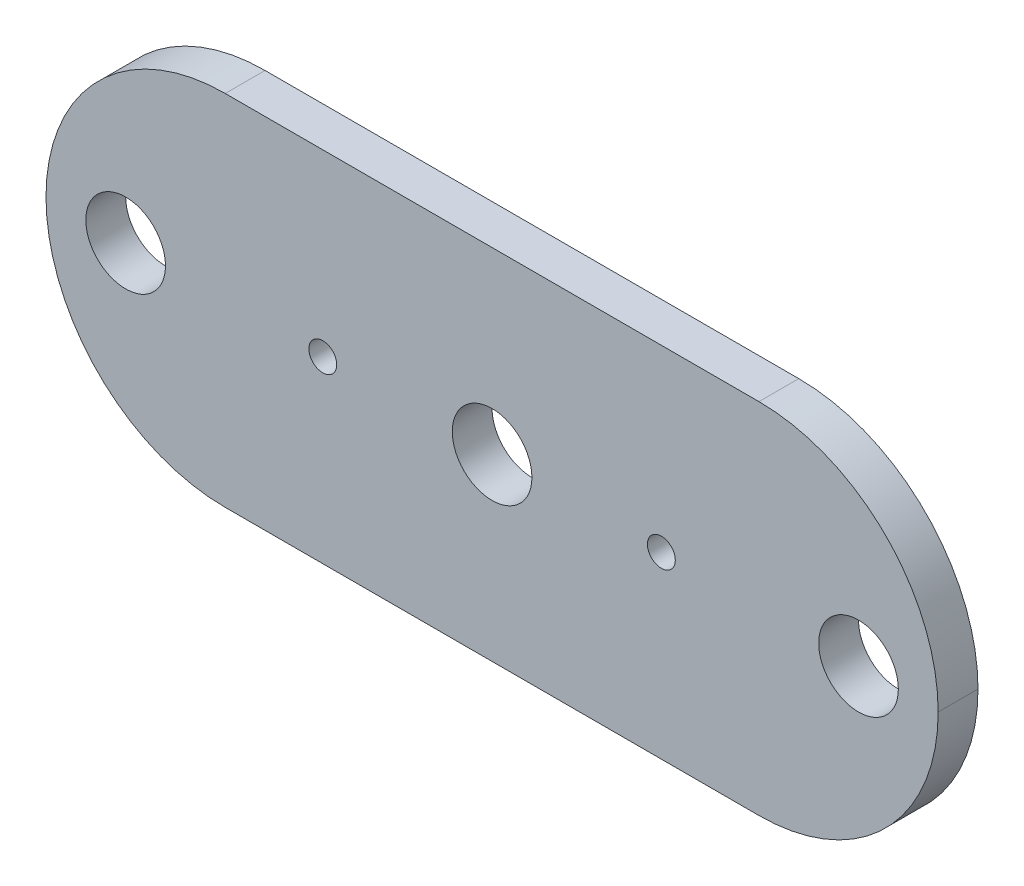
ISO-10303-21;
HEADER;
FILE_DESCRIPTION(('STEP AP214'),'2;1');
FILE_NAME('part.step','',(''),(''),'','','');
FILE_SCHEMA(('AUTOMOTIVE_DESIGN { 1 0 10303 214 1 1 1 1 }'));
ENDSEC;
DATA;
#1=APPLICATION_CONTEXT('core data for automotive mechanical design processes');
#2=APPLICATION_PROTOCOL_DEFINITION('international standard','automotive_design',2000,#1);
#3=PRODUCT_CONTEXT('',#1,'mechanical');
#4=PRODUCT('Part','Part','',(#3));
#5=PRODUCT_RELATED_PRODUCT_CATEGORY('part','',(#4));
#6=PRODUCT_DEFINITION_FORMATION('','',#4);
#7=PRODUCT_DEFINITION_CONTEXT('part definition',#1,'design');
#8=PRODUCT_DEFINITION('design','',#6,#7);
#9=PRODUCT_DEFINITION_SHAPE('','',#8);
#10=(LENGTH_UNIT() NAMED_UNIT(*) SI_UNIT(.MILLI.,.METRE.));
#11=(NAMED_UNIT(*) PLANE_ANGLE_UNIT() SI_UNIT($,.RADIAN.));
#12=(NAMED_UNIT(*) SI_UNIT($,.STERADIAN.) SOLID_ANGLE_UNIT());
#13=UNCERTAINTY_MEASURE_WITH_UNIT(LENGTH_MEASURE(1.E-05),#10,'distance_accuracy_value','');
#14=(GEOMETRIC_REPRESENTATION_CONTEXT(3) GLOBAL_UNCERTAINTY_ASSIGNED_CONTEXT((#13)) GLOBAL_UNIT_ASSIGNED_CONTEXT((#10,
#11,#12)) REPRESENTATION_CONTEXT('',''));
#15=CARTESIAN_POINT('',(0.,0.,0.));
#16=DIRECTION('',(0.,0.,1.));
#17=DIRECTION('',(1.,0.,0.));
#18=AXIS2_PLACEMENT_3D('',#15,#16,#17);
#19=CARTESIAN_POINT('',(0.,0.,5.));
#20=DIRECTION('',(0.,0.,1.));
#21=DIRECTION('',(1.,0.,0.));
#22=AXIS2_PLACEMENT_3D('',#19,#20,#21);
#23=PLANE('',#22);
#24=CARTESIAN_POINT('',(-46.,0.,5.));
#25=DIRECTION('',(0.,0.,1.));
#26=DIRECTION('',(-1.,0.,0.));
#27=AXIS2_PLACEMENT_3D('',#24,#25,#26);
#28=CIRCLE('',#27,5.);
#29=CARTESIAN_POINT('',(-51.,0.,5.));
#30=VERTEX_POINT('',#29);
#31=EDGE_CURVE('E167',#30,#30,#28,.T.);
#32=ORIENTED_EDGE('',*,*,#31,.F.);
#33=EDGE_LOOP('',(#32));
#34=FACE_BOUND('',#33,.T.);
#35=CARTESIAN_POINT('',(-21.25,0.,5.));
#36=DIRECTION('',(0.,0.,1.));
#37=DIRECTION('',(-1.,0.,0.));
#38=AXIS2_PLACEMENT_3D('',#35,#36,#37);
#39=CIRCLE('',#38,1.75);
#40=CARTESIAN_POINT('',(-23.,0.,5.));
#41=VERTEX_POINT('',#40);
#42=EDGE_CURVE('E156',#41,#41,#39,.T.);
#43=ORIENTED_EDGE('',*,*,#42,.F.);
#44=EDGE_LOOP('',(#43));
#45=FACE_BOUND('',#44,.T.);
#46=CARTESIAN_POINT('',(-33.5,0.,5.));
#47=DIRECTION('',(0.,0.,1.));
#48=DIRECTION('',(1.,0.,0.));
#49=AXIS2_PLACEMENT_3D('',#46,#47,#48);
#50=CIRCLE('',#49,22.5);
#51=CARTESIAN_POINT('',(-33.5,22.5,5.));
#52=VERTEX_POINT('',#51);
#53=CARTESIAN_POINT('',(-56.,0.,5.));
#54=VERTEX_POINT('',#53);
#55=EDGE_CURVE('E133',#52,#54,#50,.T.);
#56=ORIENTED_EDGE('',*,*,#55,.T.);
#57=CARTESIAN_POINT('',(-33.5,0.,5.));
#58=DIRECTION('',(0.,0.,1.));
#59=DIRECTION('',(1.,0.,0.));
#60=AXIS2_PLACEMENT_3D('',#57,#58,#59);
#61=CIRCLE('',#60,22.5);
#62=CARTESIAN_POINT('',(-33.5,-22.5,5.));
#63=VERTEX_POINT('',#62);
#64=EDGE_CURVE('E135',#54,#63,#61,.T.);
#65=ORIENTED_EDGE('',*,*,#64,.T.);
#66=DIRECTION('',(1.,0.,0.));
#67=VECTOR('',#66,1.);
#68=CARTESIAN_POINT('',(-56.,-22.5,5.));
#69=LINE('',#68,#67);
#70=CARTESIAN_POINT('',(33.5,-22.5,5.));
#71=VERTEX_POINT('',#70);
#72=EDGE_CURVE('E107',#63,#71,#69,.T.);
#73=ORIENTED_EDGE('',*,*,#72,.T.);
#74=CARTESIAN_POINT('',(33.5,0.,5.));
#75=DIRECTION('',(0.,0.,1.));
#76=DIRECTION('',(1.,0.,0.));
#77=AXIS2_PLACEMENT_3D('',#74,#75,#76);
#78=CIRCLE('',#77,22.5);
#79=CARTESIAN_POINT('',(56.,0.,5.));
#80=VERTEX_POINT('',#79);
#81=EDGE_CURVE('E131',#71,#80,#78,.T.);
#82=ORIENTED_EDGE('',*,*,#81,.T.);
#83=CARTESIAN_POINT('',(33.5,0.,5.));
#84=DIRECTION('',(0.,0.,1.));
#85=DIRECTION('',(1.,0.,0.));
#86=AXIS2_PLACEMENT_3D('',#83,#84,#85);
#87=CIRCLE('',#86,22.5);
#88=CARTESIAN_POINT('',(33.5,22.5,5.));
#89=VERTEX_POINT('',#88);
#90=EDGE_CURVE('E55',#80,#89,#87,.T.);
#91=ORIENTED_EDGE('',*,*,#90,.T.);
#92=DIRECTION('',(-1.,0.,0.));
#93=VECTOR('',#92,1.);
#94=CARTESIAN_POINT('',(-56.,22.5,5.));
#95=LINE('',#94,#93);
#96=EDGE_CURVE('E123',#89,#52,#95,.T.);
#97=ORIENTED_EDGE('',*,*,#96,.T.);
#98=EDGE_LOOP('',(#56,#65,#73,#82,#91,#97));
#99=FACE_BOUND('',#98,.T.);
#100=CARTESIAN_POINT('',(21.25,0.,5.));
#101=DIRECTION('',(0.,0.,1.));
#102=DIRECTION('',(1.,0.,0.));
#103=AXIS2_PLACEMENT_3D('',#100,#101,#102);
#104=CIRCLE('',#103,1.75);
#105=CARTESIAN_POINT('',(23.,0.,5.));
#106=VERTEX_POINT('',#105);
#107=EDGE_CURVE('E116',#106,#106,#104,.T.);
#108=ORIENTED_EDGE('',*,*,#107,.F.);
#109=EDGE_LOOP('',(#108));
#110=FACE_BOUND('',#109,.T.);
#111=CARTESIAN_POINT('',(46.,0.,5.));
#112=DIRECTION('',(0.,0.,1.));
#113=DIRECTION('',(1.,0.,0.));
#114=AXIS2_PLACEMENT_3D('',#111,#112,#113);
#115=CIRCLE('',#114,5.);
#116=CARTESIAN_POINT('',(51.,0.,5.));
#117=VERTEX_POINT('',#116);
#118=EDGE_CURVE('E161',#117,#117,#115,.T.);
#119=ORIENTED_EDGE('',*,*,#118,.F.);
#120=EDGE_LOOP('',(#119));
#121=FACE_BOUND('',#120,.T.);
#122=CARTESIAN_POINT('',(0.,0.,5.));
#123=DIRECTION('',(0.,0.,1.));
#124=DIRECTION('',(1.,0.,0.));
#125=AXIS2_PLACEMENT_3D('',#122,#123,#124);
#126=CIRCLE('',#125,5.);
#127=CARTESIAN_POINT('',(5.,0.,5.));
#128=VERTEX_POINT('',#127);
#129=EDGE_CURVE('E139',#128,#128,#126,.T.);
#130=ORIENTED_EDGE('',*,*,#129,.F.);
#131=EDGE_LOOP('',(#130));
#132=FACE_BOUND('',#131,.T.);
#133=ADVANCED_FACE('F33',(#34,#45,#99,#110,#121,#132),#23,.T.);
#134=CARTESIAN_POINT('',(0.,0.,0.));
#135=DIRECTION('',(0.,0.,1.));
#136=DIRECTION('',(1.,0.,0.));
#137=AXIS2_PLACEMENT_3D('',#134,#135,#136);
#138=PLANE('',#137);
#139=DIRECTION('',(1.,0.,0.));
#140=VECTOR('',#139,1.);
#141=CARTESIAN_POINT('',(-56.,-22.5,0.));
#142=LINE('',#141,#140);
#143=CARTESIAN_POINT('',(-33.5,-22.5,0.));
#144=VERTEX_POINT('',#143);
#145=CARTESIAN_POINT('',(33.5,-22.5,0.));
#146=VERTEX_POINT('',#145);
#147=EDGE_CURVE('E104',#144,#146,#142,.T.);
#148=ORIENTED_EDGE('',*,*,#147,.F.);
#149=CARTESIAN_POINT('',(-33.5,0.,0.));
#150=DIRECTION('',(0.,0.,1.));
#151=DIRECTION('',(1.,0.,0.));
#152=AXIS2_PLACEMENT_3D('',#149,#150,#151);
#153=CIRCLE('',#152,22.5);
#154=CARTESIAN_POINT('',(-56.,0.,0.));
#155=VERTEX_POINT('',#154);
#156=EDGE_CURVE('E87',#144,#155,#153,.F.);
#157=ORIENTED_EDGE('',*,*,#156,.T.);
#158=CARTESIAN_POINT('',(-33.5,0.,0.));
#159=DIRECTION('',(0.,0.,1.));
#160=DIRECTION('',(1.,0.,0.));
#161=AXIS2_PLACEMENT_3D('',#158,#159,#160);
#162=CIRCLE('',#161,22.5);
#163=CARTESIAN_POINT('',(-33.5,22.5,0.));
#164=VERTEX_POINT('',#163);
#165=EDGE_CURVE('E97',#155,#164,#162,.F.);
#166=ORIENTED_EDGE('',*,*,#165,.T.);
#167=DIRECTION('',(-1.,0.,0.));
#168=VECTOR('',#167,1.);
#169=CARTESIAN_POINT('',(-56.,22.5,0.));
#170=LINE('',#169,#168);
#171=CARTESIAN_POINT('',(33.5,22.5,0.));
#172=VERTEX_POINT('',#171);
#173=EDGE_CURVE('E115',#172,#164,#170,.T.);
#174=ORIENTED_EDGE('',*,*,#173,.F.);
#175=CARTESIAN_POINT('',(33.5,0.,0.));
#176=DIRECTION('',(0.,0.,1.));
#177=DIRECTION('',(1.,0.,0.));
#178=AXIS2_PLACEMENT_3D('',#175,#176,#177);
#179=CIRCLE('',#178,22.5);
#180=CARTESIAN_POINT('',(56.,0.,0.));
#181=VERTEX_POINT('',#180);
#182=EDGE_CURVE('E108',#172,#181,#179,.F.);
#183=ORIENTED_EDGE('',*,*,#182,.T.);
#184=CARTESIAN_POINT('',(33.5,0.,0.));
#185=DIRECTION('',(0.,0.,1.));
#186=DIRECTION('',(1.,0.,0.));
#187=AXIS2_PLACEMENT_3D('',#184,#185,#186);
#188=CIRCLE('',#187,22.5);
#189=EDGE_CURVE('E114',#181,#146,#188,.F.);
#190=ORIENTED_EDGE('',*,*,#189,.T.);
#191=EDGE_LOOP('',(#148,#157,#166,#174,#183,#190));
#192=FACE_BOUND('',#191,.T.);
#193=CARTESIAN_POINT('',(21.25,0.,0.));
#194=DIRECTION('',(0.,0.,1.));
#195=DIRECTION('',(1.,0.,0.));
#196=AXIS2_PLACEMENT_3D('',#193,#194,#195);
#197=CIRCLE('',#196,1.75);
#198=CARTESIAN_POINT('',(23.,0.,0.));
#199=VERTEX_POINT('',#198);
#200=EDGE_CURVE('E120',#199,#199,#197,.T.);
#201=ORIENTED_EDGE('',*,*,#200,.T.);
#202=EDGE_LOOP('',(#201));
#203=FACE_BOUND('',#202,.T.);
#204=CARTESIAN_POINT('',(-21.25,0.,0.));
#205=DIRECTION('',(0.,0.,1.));
#206=DIRECTION('',(-1.,0.,0.));
#207=AXIS2_PLACEMENT_3D('',#204,#205,#206);
#208=CIRCLE('',#207,1.75);
#209=CARTESIAN_POINT('',(-23.,0.,0.));
#210=VERTEX_POINT('',#209);
#211=EDGE_CURVE('E158',#210,#210,#208,.T.);
#212=ORIENTED_EDGE('',*,*,#211,.T.);
#213=EDGE_LOOP('',(#212));
#214=FACE_BOUND('',#213,.T.);
#215=CARTESIAN_POINT('',(46.,0.,0.));
#216=DIRECTION('',(0.,0.,1.));
#217=DIRECTION('',(1.,0.,0.));
#218=AXIS2_PLACEMENT_3D('',#215,#216,#217);
#219=CIRCLE('',#218,5.);
#220=CARTESIAN_POINT('',(51.,0.,0.));
#221=VERTEX_POINT('',#220);
#222=EDGE_CURVE('E164',#221,#221,#219,.T.);
#223=ORIENTED_EDGE('',*,*,#222,.T.);
#224=EDGE_LOOP('',(#223));
#225=FACE_BOUND('',#224,.T.);
#226=CARTESIAN_POINT('',(-46.,0.,0.));
#227=DIRECTION('',(0.,0.,1.));
#228=DIRECTION('',(-1.,0.,0.));
#229=AXIS2_PLACEMENT_3D('',#226,#227,#228);
#230=CIRCLE('',#229,5.);
#231=CARTESIAN_POINT('',(-51.,0.,0.));
#232=VERTEX_POINT('',#231);
#233=EDGE_CURVE('E170',#232,#232,#230,.T.);
#234=ORIENTED_EDGE('',*,*,#233,.T.);
#235=EDGE_LOOP('',(#234));
#236=FACE_BOUND('',#235,.T.);
#237=CARTESIAN_POINT('',(0.,0.,0.));
#238=DIRECTION('',(0.,0.,1.));
#239=DIRECTION('',(1.,0.,0.));
#240=AXIS2_PLACEMENT_3D('',#237,#238,#239);
#241=CIRCLE('',#240,5.);
#242=CARTESIAN_POINT('',(5.,0.,0.));
#243=VERTEX_POINT('',#242);
#244=EDGE_CURVE('E137',#243,#243,#241,.T.);
#245=ORIENTED_EDGE('',*,*,#244,.T.);
#246=EDGE_LOOP('',(#245));
#247=FACE_BOUND('',#246,.T.);
#248=ADVANCED_FACE('F111',(#192,#203,#214,#225,#236,#247),#138,.F.);
#249=CARTESIAN_POINT('',(-56.,-22.5,5.));
#250=DIRECTION('',(0.,1.,0.));
#251=DIRECTION('',(0.,0.,1.));
#252=AXIS2_PLACEMENT_3D('',#249,#250,#251);
#253=PLANE('',#252);
#254=ORIENTED_EDGE('',*,*,#72,.F.);
#255=DIRECTION('',(0.,0.,-1.));
#256=VECTOR('',#255,1.);
#257=CARTESIAN_POINT('',(-33.5,-22.5,5.));
#258=LINE('',#257,#256);
#259=EDGE_CURVE('E91',#63,#144,#258,.T.);
#260=ORIENTED_EDGE('',*,*,#259,.T.);
#261=ORIENTED_EDGE('',*,*,#147,.T.);
#262=DIRECTION('',(0.,0.,-1.));
#263=VECTOR('',#262,1.);
#264=CARTESIAN_POINT('',(33.5,-22.5,5.));
#265=LINE('',#264,#263);
#266=EDGE_CURVE('E109',#146,#71,#265,.F.);
#267=ORIENTED_EDGE('',*,*,#266,.T.);
#268=EDGE_LOOP('',(#254,#260,#261,#267));
#269=FACE_BOUND('',#268,.T.);
#270=ADVANCED_FACE('F102',(#269),#253,.F.);
#271=CARTESIAN_POINT('',(-56.,22.5,5.));
#272=DIRECTION('',(0.,-1.,0.));
#273=DIRECTION('',(0.,0.,-1.));
#274=AXIS2_PLACEMENT_3D('',#271,#272,#273);
#275=PLANE('',#274);
#276=ORIENTED_EDGE('',*,*,#173,.T.);
#277=DIRECTION('',(0.,0.,-1.));
#278=VECTOR('',#277,1.);
#279=CARTESIAN_POINT('',(-33.5,22.5,5.));
#280=LINE('',#279,#278);
#281=EDGE_CURVE('E11',#164,#52,#280,.F.);
#282=ORIENTED_EDGE('',*,*,#281,.T.);
#283=ORIENTED_EDGE('',*,*,#96,.F.);
#284=DIRECTION('',(0.,0.,-1.));
#285=VECTOR('',#284,1.);
#286=CARTESIAN_POINT('',(33.5,22.5,5.));
#287=LINE('',#286,#285);
#288=EDGE_CURVE('E42',#89,#172,#287,.T.);
#289=ORIENTED_EDGE('',*,*,#288,.T.);
#290=EDGE_LOOP('',(#276,#282,#283,#289));
#291=FACE_BOUND('',#290,.T.);
#292=ADVANCED_FACE('F149',(#291),#275,.F.);
#293=CARTESIAN_POINT('',(21.25,0.,5.));
#294=DIRECTION('',(0.,0.,-1.));
#295=DIRECTION('',(-1.,0.,0.));
#296=AXIS2_PLACEMENT_3D('',#293,#294,#295);
#297=CYLINDRICAL_SURFACE('',#296,1.75);
#298=ORIENTED_EDGE('',*,*,#107,.T.);
#299=EDGE_LOOP('',(#298));
#300=FACE_BOUND('',#299,.T.);
#301=ORIENTED_EDGE('',*,*,#200,.F.);
#302=EDGE_LOOP('',(#301));
#303=FACE_BOUND('',#302,.T.);
#304=ADVANCED_FACE('F191',(#300,#303),#297,.F.);
#305=CARTESIAN_POINT('',(-21.25,0.,5.));
#306=DIRECTION('',(0.,0.,-1.));
#307=DIRECTION('',(-1.,0.,0.));
#308=AXIS2_PLACEMENT_3D('',#305,#306,#307);
#309=CYLINDRICAL_SURFACE('',#308,1.75);
#310=ORIENTED_EDGE('',*,*,#42,.T.);
#311=EDGE_LOOP('',(#310));
#312=FACE_BOUND('',#311,.T.);
#313=ORIENTED_EDGE('',*,*,#211,.F.);
#314=EDGE_LOOP('',(#313));
#315=FACE_BOUND('',#314,.T.);
#316=ADVANCED_FACE('F237',(#312,#315),#309,.F.);
#317=CARTESIAN_POINT('',(46.,0.,5.));
#318=DIRECTION('',(0.,0.,-1.));
#319=DIRECTION('',(-1.,0.,0.));
#320=AXIS2_PLACEMENT_3D('',#317,#318,#319);
#321=CYLINDRICAL_SURFACE('',#320,5.);
#322=ORIENTED_EDGE('',*,*,#118,.T.);
#323=EDGE_LOOP('',(#322));
#324=FACE_BOUND('',#323,.T.);
#325=ORIENTED_EDGE('',*,*,#222,.F.);
#326=EDGE_LOOP('',(#325));
#327=FACE_BOUND('',#326,.T.);
#328=ADVANCED_FACE('F229',(#324,#327),#321,.F.);
#329=CARTESIAN_POINT('',(-46.,0.,5.));
#330=DIRECTION('',(0.,0.,-1.));
#331=DIRECTION('',(-1.,0.,0.));
#332=AXIS2_PLACEMENT_3D('',#329,#330,#331);
#333=CYLINDRICAL_SURFACE('',#332,5.);
#334=ORIENTED_EDGE('',*,*,#31,.T.);
#335=EDGE_LOOP('',(#334));
#336=FACE_BOUND('',#335,.T.);
#337=ORIENTED_EDGE('',*,*,#233,.F.);
#338=EDGE_LOOP('',(#337));
#339=FACE_BOUND('',#338,.T.);
#340=ADVANCED_FACE('F222',(#336,#339),#333,.F.);
#341=CARTESIAN_POINT('',(0.,0.,5.));
#342=DIRECTION('',(0.,0.,-1.));
#343=DIRECTION('',(-1.,0.,0.));
#344=AXIS2_PLACEMENT_3D('',#341,#342,#343);
#345=CYLINDRICAL_SURFACE('',#344,5.);
#346=ORIENTED_EDGE('',*,*,#129,.T.);
#347=EDGE_LOOP('',(#346));
#348=FACE_BOUND('',#347,.T.);
#349=ORIENTED_EDGE('',*,*,#244,.F.);
#350=EDGE_LOOP('',(#349));
#351=FACE_BOUND('',#350,.T.);
#352=ADVANCED_FACE('F178',(#348,#351),#345,.F.);
#353=CARTESIAN_POINT('',(-33.5,0.,5.));
#354=DIRECTION('',(0.,0.,-1.));
#355=DIRECTION('',(-1.,0.,0.));
#356=AXIS2_PLACEMENT_3D('',#353,#354,#355);
#357=CYLINDRICAL_SURFACE('',#356,22.5);
#358=DIRECTION('',(0.,0.,-1.));
#359=VECTOR('',#358,1.);
#360=CARTESIAN_POINT('',(-56.,0.,5.));
#361=LINE('',#360,#359);
#362=EDGE_CURVE('E93',#54,#155,#361,.T.);
#363=ORIENTED_EDGE('',*,*,#362,.F.);
#364=ORIENTED_EDGE('',*,*,#55,.F.);
#365=ORIENTED_EDGE('',*,*,#281,.F.);
#366=ORIENTED_EDGE('',*,*,#165,.F.);
#367=EDGE_LOOP('',(#363,#364,#365,#366));
#368=FACE_BOUND('',#367,.T.);
#369=ADVANCED_FACE('F151',(#368),#357,.T.);
#370=CARTESIAN_POINT('',(-33.5,0.,5.));
#371=DIRECTION('',(0.,0.,-1.));
#372=DIRECTION('',(-1.,0.,0.));
#373=AXIS2_PLACEMENT_3D('',#370,#371,#372);
#374=CYLINDRICAL_SURFACE('',#373,22.5);
#375=ORIENTED_EDGE('',*,*,#64,.F.);
#376=ORIENTED_EDGE('',*,*,#362,.T.);
#377=ORIENTED_EDGE('',*,*,#156,.F.);
#378=ORIENTED_EDGE('',*,*,#259,.F.);
#379=EDGE_LOOP('',(#375,#376,#377,#378));
#380=FACE_BOUND('',#379,.T.);
#381=ADVANCED_FACE('F90',(#380),#374,.T.);
#382=CARTESIAN_POINT('',(33.5,0.,5.));
#383=DIRECTION('',(0.,0.,-1.));
#384=DIRECTION('',(-1.,0.,0.));
#385=AXIS2_PLACEMENT_3D('',#382,#383,#384);
#386=CYLINDRICAL_SURFACE('',#385,22.5);
#387=ORIENTED_EDGE('',*,*,#288,.F.);
#388=ORIENTED_EDGE('',*,*,#90,.F.);
#389=DIRECTION('',(0.,0.,-1.));
#390=VECTOR('',#389,1.);
#391=CARTESIAN_POINT('',(56.,0.,5.));
#392=LINE('',#391,#390);
#393=EDGE_CURVE('E37',#181,#80,#392,.F.);
#394=ORIENTED_EDGE('',*,*,#393,.F.);
#395=ORIENTED_EDGE('',*,*,#182,.F.);
#396=EDGE_LOOP('',(#387,#388,#394,#395));
#397=FACE_BOUND('',#396,.T.);
#398=ADVANCED_FACE('F35',(#397),#386,.T.);
#399=CARTESIAN_POINT('',(33.5,0.,5.));
#400=DIRECTION('',(0.,0.,-1.));
#401=DIRECTION('',(-1.,0.,0.));
#402=AXIS2_PLACEMENT_3D('',#399,#400,#401);
#403=CYLINDRICAL_SURFACE('',#402,22.5);
#404=ORIENTED_EDGE('',*,*,#81,.F.);
#405=ORIENTED_EDGE('',*,*,#266,.F.);
#406=ORIENTED_EDGE('',*,*,#189,.F.);
#407=ORIENTED_EDGE('',*,*,#393,.T.);
#408=EDGE_LOOP('',(#404,#405,#406,#407));
#409=FACE_BOUND('',#408,.T.);
#410=ADVANCED_FACE('F144',(#409),#403,.T.);
#411=CLOSED_SHELL('',(#133,#248,#270,#292,#304,#316,#328,#340,#352,#369,#381,#398,#410));
#412=MANIFOLD_SOLID_BREP('B2',#411);
#413=ADVANCED_BREP_SHAPE_REPRESENTATION('',(#18,#412),#14);
#414=SHAPE_DEFINITION_REPRESENTATION(#9,#413);
ENDSEC;
END-ISO-10303-21;
